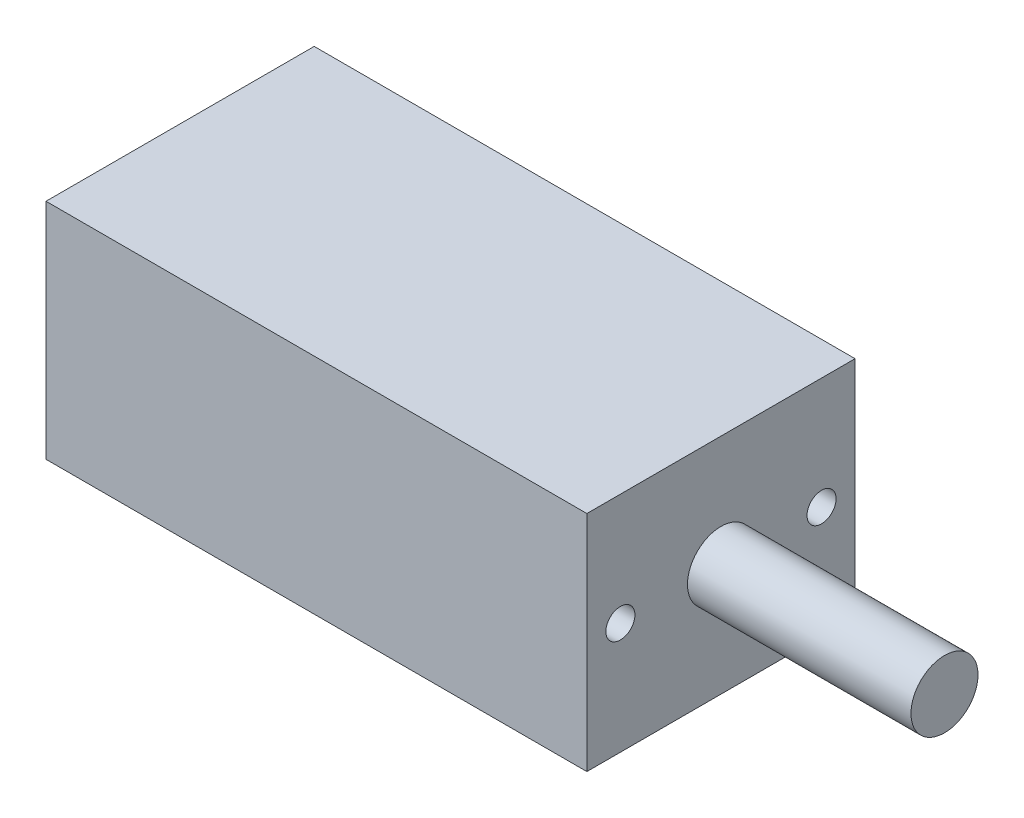
ISO-10303-21;
HEADER;
FILE_DESCRIPTION(('STEP AP214'),'2;1');
FILE_NAME('part.step','',(''),(''),'','','');
FILE_SCHEMA(('AUTOMOTIVE_DESIGN { 1 0 10303 214 1 1 1 1 }'));
ENDSEC;
DATA;
#1=APPLICATION_CONTEXT('core data for automotive mechanical design processes');
#2=APPLICATION_PROTOCOL_DEFINITION('international standard','automotive_design',2000,#1);
#3=PRODUCT_CONTEXT('',#1,'mechanical');
#4=PRODUCT('Part','Part','',(#3));
#5=PRODUCT_RELATED_PRODUCT_CATEGORY('part','',(#4));
#6=PRODUCT_DEFINITION_FORMATION('','',#4);
#7=PRODUCT_DEFINITION_CONTEXT('part definition',#1,'design');
#8=PRODUCT_DEFINITION('design','',#6,#7);
#9=PRODUCT_DEFINITION_SHAPE('','',#8);
#10=(LENGTH_UNIT() NAMED_UNIT(*) SI_UNIT(.MILLI.,.METRE.));
#11=(NAMED_UNIT(*) PLANE_ANGLE_UNIT() SI_UNIT($,.RADIAN.));
#12=(NAMED_UNIT(*) SI_UNIT($,.STERADIAN.) SOLID_ANGLE_UNIT());
#13=UNCERTAINTY_MEASURE_WITH_UNIT(LENGTH_MEASURE(1.E-05),#10,'distance_accuracy_value','');
#14=(GEOMETRIC_REPRESENTATION_CONTEXT(3) GLOBAL_UNCERTAINTY_ASSIGNED_CONTEXT((#13)) GLOBAL_UNIT_ASSIGNED_CONTEXT((#10,
#11,#12)) REPRESENTATION_CONTEXT('',''));
#15=CARTESIAN_POINT('',(0.,0.,0.));
#16=DIRECTION('',(0.,0.,1.));
#17=DIRECTION('',(1.,0.,0.));
#18=AXIS2_PLACEMENT_3D('',#15,#16,#17);
#19=CARTESIAN_POINT('',(24.2,0.,0.));
#20=DIRECTION('',(1.,0.,0.));
#21=DIRECTION('',(0.,0.,-1.));
#22=AXIS2_PLACEMENT_3D('',#19,#20,#21);
#23=PLANE('',#22);
#24=CARTESIAN_POINT('',(24.2,0.,-4.5));
#25=DIRECTION('',(1.,0.,0.));
#26=DIRECTION('',(0.,0.,-1.));
#27=AXIS2_PLACEMENT_3D('',#24,#25,#26);
#28=CIRCLE('',#27,0.65);
#29=CARTESIAN_POINT('',(24.2,0.,-5.15));
#30=VERTEX_POINT('',#29);
#31=EDGE_CURVE('E123',#30,#30,#28,.T.);
#32=ORIENTED_EDGE('',*,*,#31,.F.);
#33=EDGE_LOOP('',(#32));
#34=FACE_BOUND('',#33,.T.);
#35=CARTESIAN_POINT('',(24.2,0.,4.5));
#36=DIRECTION('',(1.,0.,0.));
#37=DIRECTION('',(0.,0.,-1.));
#38=AXIS2_PLACEMENT_3D('',#35,#36,#37);
#39=CIRCLE('',#38,0.65);
#40=CARTESIAN_POINT('',(24.2,0.,3.85));
#41=VERTEX_POINT('',#40);
#42=EDGE_CURVE('E117',#41,#41,#39,.T.);
#43=ORIENTED_EDGE('',*,*,#42,.F.);
#44=EDGE_LOOP('',(#43));
#45=FACE_BOUND('',#44,.T.);
#46=DIRECTION('',(0.,1.,0.));
#47=VECTOR('',#46,1.);
#48=CARTESIAN_POINT('',(24.2,5.00000000000001,-5.99999999999999));
#49=LINE('',#48,#47);
#50=CARTESIAN_POINT('',(24.2,-4.99999999999999,-5.99999999999999));
#51=VERTEX_POINT('',#50);
#52=CARTESIAN_POINT('',(24.2,5.00000000000001,-5.99999999999999));
#53=VERTEX_POINT('',#52);
#54=EDGE_CURVE('E85',#51,#53,#49,.T.);
#55=ORIENTED_EDGE('',*,*,#54,.T.);
#56=DIRECTION('',(0.,0.,1.));
#57=VECTOR('',#56,1.);
#58=CARTESIAN_POINT('',(24.2,5.00000000000001,6.00000000000001));
#59=LINE('',#58,#57);
#60=CARTESIAN_POINT('',(24.2,5.00000000000001,6.00000000000001));
#61=VERTEX_POINT('',#60);
#62=EDGE_CURVE('E80',#53,#61,#59,.T.);
#63=ORIENTED_EDGE('',*,*,#62,.T.);
#64=DIRECTION('',(0.,-1.,0.));
#65=VECTOR('',#64,1.);
#66=CARTESIAN_POINT('',(24.2,5.00000000000001,6.00000000000001));
#67=LINE('',#66,#65);
#68=CARTESIAN_POINT('',(24.2,-4.99999999999999,6.));
#69=VERTEX_POINT('',#68);
#70=EDGE_CURVE('E83',#61,#69,#67,.T.);
#71=ORIENTED_EDGE('',*,*,#70,.T.);
#72=DIRECTION('',(0.,0.,-1.));
#73=VECTOR('',#72,1.);
#74=CARTESIAN_POINT('',(24.2,-4.99999999999999,6.));
#75=LINE('',#74,#73);
#76=EDGE_CURVE('E50',#69,#51,#75,.T.);
#77=ORIENTED_EDGE('',*,*,#76,.T.);
#78=EDGE_LOOP('',(#55,#63,#71,#77));
#79=FACE_BOUND('',#78,.T.);
#80=CARTESIAN_POINT('',(24.2,0.,0.));
#81=DIRECTION('',(1.,0.,0.));
#82=DIRECTION('',(0.,0.,-1.));
#83=AXIS2_PLACEMENT_3D('',#80,#81,#82);
#84=CIRCLE('',#83,1.5);
#85=CARTESIAN_POINT('',(24.2,0.,-1.5));
#86=VERTEX_POINT('',#85);
#87=EDGE_CURVE('E111',#86,#86,#84,.T.);
#88=ORIENTED_EDGE('',*,*,#87,.F.);
#89=EDGE_LOOP('',(#88));
#90=FACE_BOUND('',#89,.T.);
#91=ADVANCED_FACE('F33',(#34,#45,#79,#90),#23,.T.);
#92=CARTESIAN_POINT('',(24.2,5.00000000000001,-5.99999999999999));
#93=DIRECTION('',(0.,0.,1.));
#94=DIRECTION('',(1.,0.,0.));
#95=AXIS2_PLACEMENT_3D('',#92,#93,#94);
#96=PLANE('',#95);
#97=DIRECTION('',(0.,1.,0.));
#98=VECTOR('',#97,1.);
#99=CARTESIAN_POINT('',(0.,5.00000000000001,-5.99999999999999));
#100=LINE('',#99,#98);
#101=CARTESIAN_POINT('',(0.,-4.99999999999999,-5.99999999999999));
#102=VERTEX_POINT('',#101);
#103=CARTESIAN_POINT('',(0.,5.00000000000001,-5.99999999999999));
#104=VERTEX_POINT('',#103);
#105=EDGE_CURVE('E97',#102,#104,#100,.T.);
#106=ORIENTED_EDGE('',*,*,#105,.T.);
#107=DIRECTION('',(-1.,0.,0.));
#108=VECTOR('',#107,1.);
#109=CARTESIAN_POINT('',(24.2,5.00000000000001,-5.99999999999999));
#110=LINE('',#109,#108);
#111=EDGE_CURVE('E11',#53,#104,#110,.T.);
#112=ORIENTED_EDGE('',*,*,#111,.F.);
#113=ORIENTED_EDGE('',*,*,#54,.F.);
#114=DIRECTION('',(-1.,0.,0.));
#115=VECTOR('',#114,1.);
#116=CARTESIAN_POINT('',(24.2,-4.99999999999999,-5.99999999999999));
#117=LINE('',#116,#115);
#118=EDGE_CURVE('E93',#51,#102,#117,.T.);
#119=ORIENTED_EDGE('',*,*,#118,.T.);
#120=EDGE_LOOP('',(#106,#112,#113,#119));
#121=FACE_BOUND('',#120,.T.);
#122=ADVANCED_FACE('F35',(#121),#96,.F.);
#123=CARTESIAN_POINT('',(24.2,5.00000000000001,6.00000000000001));
#124=DIRECTION('',(0.,-1.,0.));
#125=DIRECTION('',(0.,0.,-1.));
#126=AXIS2_PLACEMENT_3D('',#123,#124,#125);
#127=PLANE('',#126);
#128=DIRECTION('',(0.,0.,1.));
#129=VECTOR('',#128,1.);
#130=CARTESIAN_POINT('',(0.,5.00000000000001,6.00000000000001));
#131=LINE('',#130,#129);
#132=CARTESIAN_POINT('',(0.,5.00000000000001,6.00000000000001));
#133=VERTEX_POINT('',#132);
#134=EDGE_CURVE('E89',#104,#133,#131,.T.);
#135=ORIENTED_EDGE('',*,*,#134,.T.);
#136=DIRECTION('',(-1.,0.,0.));
#137=VECTOR('',#136,1.);
#138=CARTESIAN_POINT('',(24.2,5.00000000000001,6.00000000000001));
#139=LINE('',#138,#137);
#140=EDGE_CURVE('E42',#61,#133,#139,.T.);
#141=ORIENTED_EDGE('',*,*,#140,.F.);
#142=ORIENTED_EDGE('',*,*,#62,.F.);
#143=ORIENTED_EDGE('',*,*,#111,.T.);
#144=EDGE_LOOP('',(#135,#141,#142,#143));
#145=FACE_BOUND('',#144,.T.);
#146=ADVANCED_FACE('F88',(#145),#127,.F.);
#147=CARTESIAN_POINT('',(24.2,5.00000000000001,6.00000000000001));
#148=DIRECTION('',(0.,0.,-1.));
#149=DIRECTION('',(0.,1.,0.));
#150=AXIS2_PLACEMENT_3D('',#147,#148,#149);
#151=PLANE('',#150);
#152=DIRECTION('',(0.,-1.,0.));
#153=VECTOR('',#152,1.);
#154=CARTESIAN_POINT('',(0.,5.00000000000001,6.00000000000001));
#155=LINE('',#154,#153);
#156=CARTESIAN_POINT('',(0.,-4.99999999999999,6.));
#157=VERTEX_POINT('',#156);
#158=EDGE_CURVE('E67',#133,#157,#155,.T.);
#159=ORIENTED_EDGE('',*,*,#158,.T.);
#160=DIRECTION('',(-1.,0.,0.));
#161=VECTOR('',#160,1.);
#162=CARTESIAN_POINT('',(24.2,-4.99999999999999,6.));
#163=LINE('',#162,#161);
#164=EDGE_CURVE('E90',#69,#157,#163,.T.);
#165=ORIENTED_EDGE('',*,*,#164,.F.);
#166=ORIENTED_EDGE('',*,*,#70,.F.);
#167=ORIENTED_EDGE('',*,*,#140,.T.);
#168=EDGE_LOOP('',(#159,#165,#166,#167));
#169=FACE_BOUND('',#168,.T.);
#170=ADVANCED_FACE('F91',(#169),#151,.F.);
#171=CARTESIAN_POINT('',(24.2,-4.99999999999999,6.));
#172=DIRECTION('',(0.,1.,0.));
#173=DIRECTION('',(0.,0.,1.));
#174=AXIS2_PLACEMENT_3D('',#171,#172,#173);
#175=PLANE('',#174);
#176=DIRECTION('',(0.,0.,-1.));
#177=VECTOR('',#176,1.);
#178=CARTESIAN_POINT('',(0.,-4.99999999999999,6.));
#179=LINE('',#178,#177);
#180=EDGE_CURVE('E73',#157,#102,#179,.T.);
#181=ORIENTED_EDGE('',*,*,#180,.T.);
#182=ORIENTED_EDGE('',*,*,#118,.F.);
#183=ORIENTED_EDGE('',*,*,#76,.F.);
#184=ORIENTED_EDGE('',*,*,#164,.T.);
#185=EDGE_LOOP('',(#181,#182,#183,#184));
#186=FACE_BOUND('',#185,.T.);
#187=ADVANCED_FACE('F105',(#186),#175,.F.);
#188=CARTESIAN_POINT('',(0.,0.,0.));
#189=DIRECTION('',(1.,0.,0.));
#190=DIRECTION('',(0.,0.,-1.));
#191=AXIS2_PLACEMENT_3D('',#188,#189,#190);
#192=PLANE('',#191);
#193=ORIENTED_EDGE('',*,*,#105,.F.);
#194=ORIENTED_EDGE('',*,*,#180,.F.);
#195=ORIENTED_EDGE('',*,*,#158,.F.);
#196=ORIENTED_EDGE('',*,*,#134,.F.);
#197=EDGE_LOOP('',(#193,#194,#195,#196));
#198=FACE_BOUND('',#197,.T.);
#199=ADVANCED_FACE('F108',(#198),#192,.F.);
#200=CARTESIAN_POINT('',(34.2,0.,0.));
#201=DIRECTION('',(-1.,0.,0.));
#202=DIRECTION('',(0.,0.,1.));
#203=AXIS2_PLACEMENT_3D('',#200,#201,#202);
#204=CYLINDRICAL_SURFACE('',#203,1.5);
#205=CARTESIAN_POINT('',(34.2,0.,0.));
#206=DIRECTION('',(1.,0.,0.));
#207=DIRECTION('',(0.,0.,-1.));
#208=AXIS2_PLACEMENT_3D('',#205,#206,#207);
#209=CIRCLE('',#208,1.5);
#210=CARTESIAN_POINT('',(34.2,0.,-1.5));
#211=VERTEX_POINT('',#210);
#212=EDGE_CURVE('E100',#211,#211,#209,.T.);
#213=ORIENTED_EDGE('',*,*,#212,.F.);
#214=EDGE_LOOP('',(#213));
#215=FACE_BOUND('',#214,.T.);
#216=ORIENTED_EDGE('',*,*,#87,.T.);
#217=EDGE_LOOP('',(#216));
#218=FACE_BOUND('',#217,.T.);
#219=ADVANCED_FACE('F154',(#215,#218),#204,.T.);
#220=CARTESIAN_POINT('',(34.2,0.,0.));
#221=DIRECTION('',(1.,0.,0.));
#222=DIRECTION('',(0.,0.,-1.));
#223=AXIS2_PLACEMENT_3D('',#220,#221,#222);
#224=PLANE('',#223);
#225=ORIENTED_EDGE('',*,*,#212,.T.);
#226=EDGE_LOOP('',(#225));
#227=FACE_BOUND('',#226,.T.);
#228=ADVANCED_FACE('F145',(#227),#224,.T.);
#229=CARTESIAN_POINT('',(23.2,0.,4.5));
#230=DIRECTION('',(1.,0.,0.));
#231=DIRECTION('',(0.,0.,-1.));
#232=AXIS2_PLACEMENT_3D('',#229,#230,#231);
#233=CYLINDRICAL_SURFACE('',#232,0.65);
#234=CARTESIAN_POINT('',(23.2,0.,4.5));
#235=DIRECTION('',(1.,0.,0.));
#236=DIRECTION('',(0.,0.,-1.));
#237=AXIS2_PLACEMENT_3D('',#234,#235,#236);
#238=CIRCLE('',#237,0.65);
#239=CARTESIAN_POINT('',(23.2,0.,3.85));
#240=VERTEX_POINT('',#239);
#241=EDGE_CURVE('E114',#240,#240,#238,.T.);
#242=ORIENTED_EDGE('',*,*,#241,.F.);
#243=EDGE_LOOP('',(#242));
#244=FACE_BOUND('',#243,.T.);
#245=ORIENTED_EDGE('',*,*,#42,.T.);
#246=EDGE_LOOP('',(#245));
#247=FACE_BOUND('',#246,.T.);
#248=ADVANCED_FACE('F143',(#244,#247),#233,.F.);
#249=CARTESIAN_POINT('',(23.2,0.,4.5));
#250=DIRECTION('',(1.,0.,0.));
#251=DIRECTION('',(0.,0.,-1.));
#252=AXIS2_PLACEMENT_3D('',#249,#250,#251);
#253=PLANE('',#252);
#254=ORIENTED_EDGE('',*,*,#241,.T.);
#255=EDGE_LOOP('',(#254));
#256=FACE_BOUND('',#255,.T.);
#257=ADVANCED_FACE('F134',(#256),#253,.T.);
#258=CARTESIAN_POINT('',(23.2,0.,-4.5));
#259=DIRECTION('',(1.,0.,0.));
#260=DIRECTION('',(0.,0.,-1.));
#261=AXIS2_PLACEMENT_3D('',#258,#259,#260);
#262=CYLINDRICAL_SURFACE('',#261,0.65);
#263=CARTESIAN_POINT('',(23.2,0.,-4.5));
#264=DIRECTION('',(1.,0.,0.));
#265=DIRECTION('',(0.,0.,-1.));
#266=AXIS2_PLACEMENT_3D('',#263,#264,#265);
#267=CIRCLE('',#266,0.65);
#268=CARTESIAN_POINT('',(23.2,0.,-5.15));
#269=VERTEX_POINT('',#268);
#270=EDGE_CURVE('E120',#269,#269,#267,.T.);
#271=ORIENTED_EDGE('',*,*,#270,.F.);
#272=EDGE_LOOP('',(#271));
#273=FACE_BOUND('',#272,.T.);
#274=ORIENTED_EDGE('',*,*,#31,.T.);
#275=EDGE_LOOP('',(#274));
#276=FACE_BOUND('',#275,.T.);
#277=ADVANCED_FACE('F131',(#273,#276),#262,.F.);
#278=CARTESIAN_POINT('',(23.2,0.,-4.5));
#279=DIRECTION('',(1.,0.,0.));
#280=DIRECTION('',(0.,0.,-1.));
#281=AXIS2_PLACEMENT_3D('',#278,#279,#280);
#282=PLANE('',#281);
#283=ORIENTED_EDGE('',*,*,#270,.T.);
#284=EDGE_LOOP('',(#283));
#285=FACE_BOUND('',#284,.T.);
#286=ADVANCED_FACE('F129',(#285),#282,.T.);
#287=CLOSED_SHELL('',(#91,#122,#146,#170,#187,#199,#219,#228,#248,#257,#277,#286));
#288=MANIFOLD_SOLID_BREP('B2',#287);
#289=ADVANCED_BREP_SHAPE_REPRESENTATION('',(#18,#288),#14);
#290=SHAPE_DEFINITION_REPRESENTATION(#9,#289);
ENDSEC;
END-ISO-10303-21;
